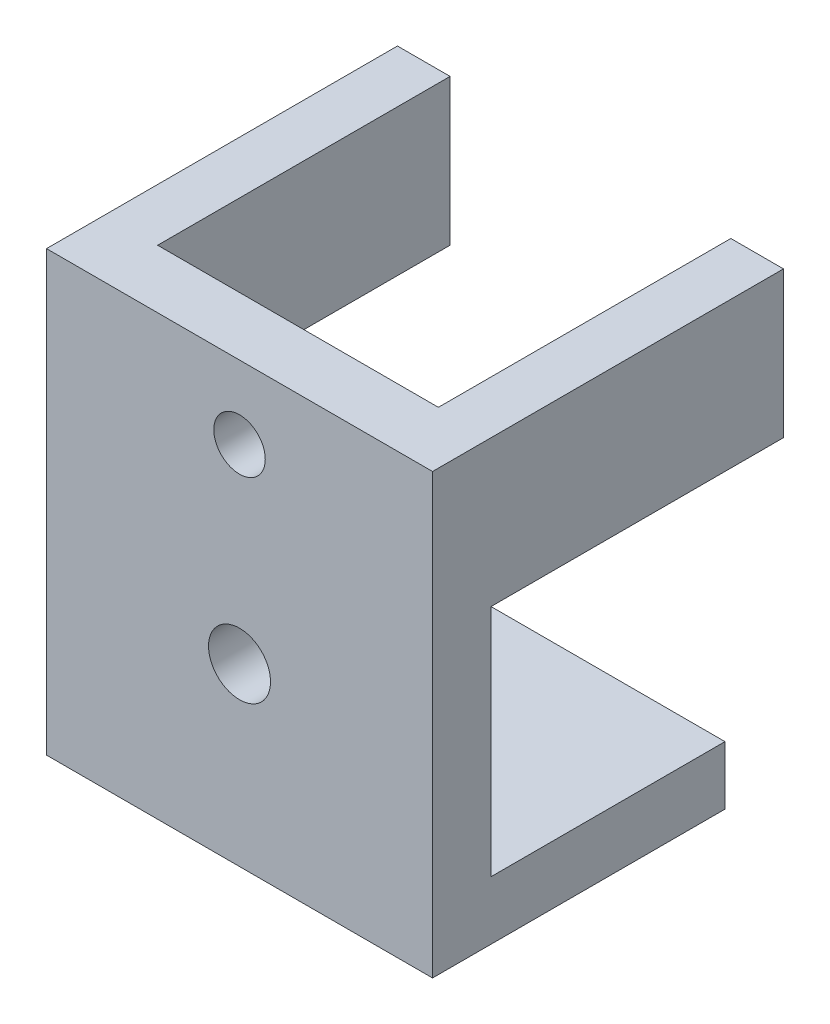
ISO-10303-21;
HEADER;
FILE_DESCRIPTION(('STEP AP214'),'2;1');
FILE_NAME('part.step','',(''),(''),'','','');
FILE_SCHEMA(('AUTOMOTIVE_DESIGN { 1 0 10303 214 1 1 1 1 }'));
ENDSEC;
DATA;
#1=APPLICATION_CONTEXT('core data for automotive mechanical design processes');
#2=APPLICATION_PROTOCOL_DEFINITION('international standard','automotive_design',2000,#1);
#3=PRODUCT_CONTEXT('',#1,'mechanical');
#4=PRODUCT('Part','Part','',(#3));
#5=PRODUCT_RELATED_PRODUCT_CATEGORY('part','',(#4));
#6=PRODUCT_DEFINITION_FORMATION('','',#4);
#7=PRODUCT_DEFINITION_CONTEXT('part definition',#1,'design');
#8=PRODUCT_DEFINITION('design','',#6,#7);
#9=PRODUCT_DEFINITION_SHAPE('','',#8);
#10=(LENGTH_UNIT() NAMED_UNIT(*) SI_UNIT(.MILLI.,.METRE.));
#11=(NAMED_UNIT(*) PLANE_ANGLE_UNIT() SI_UNIT($,.RADIAN.));
#12=(NAMED_UNIT(*) SI_UNIT($,.STERADIAN.) SOLID_ANGLE_UNIT());
#13=UNCERTAINTY_MEASURE_WITH_UNIT(LENGTH_MEASURE(1.E-05),#10,'distance_accuracy_value','');
#14=(GEOMETRIC_REPRESENTATION_CONTEXT(3) GLOBAL_UNCERTAINTY_ASSIGNED_CONTEXT((#13)) GLOBAL_UNIT_ASSIGNED_CONTEXT((#10,
#11,#12)) REPRESENTATION_CONTEXT('',''));
#15=CARTESIAN_POINT('',(0.,0.,0.));
#16=DIRECTION('',(0.,0.,1.));
#17=DIRECTION('',(1.,0.,0.));
#18=AXIS2_PLACEMENT_3D('',#15,#16,#17);
#19=CARTESIAN_POINT('',(0.,0.,0.));
#20=DIRECTION('',(0.,0.,-1.));
#21=DIRECTION('',(-1.,0.,0.));
#22=AXIS2_PLACEMENT_3D('',#19,#20,#21);
#23=PLANE('',#22);
#24=CARTESIAN_POINT('',(16.5,31.25,0.));
#25=DIRECTION('',(0.,0.,-1.));
#26=DIRECTION('',(-1.,0.,0.));
#27=AXIS2_PLACEMENT_3D('',#24,#25,#26);
#28=CIRCLE('',#27,2.2);
#29=CARTESIAN_POINT('',(14.3,31.25,0.));
#30=VERTEX_POINT('',#29);
#31=EDGE_CURVE('E158',#30,#30,#28,.T.);
#32=ORIENTED_EDGE('',*,*,#31,.F.);
#33=EDGE_LOOP('',(#32));
#34=FACE_BOUND('',#33,.T.);
#35=CARTESIAN_POINT('',(16.5,15.,0.));
#36=DIRECTION('',(0.,0.,-1.));
#37=DIRECTION('',(-1.,0.,0.));
#38=AXIS2_PLACEMENT_3D('',#35,#36,#37);
#39=CIRCLE('',#38,2.65);
#40=CARTESIAN_POINT('',(13.85,15.,0.));
#41=VERTEX_POINT('',#40);
#42=EDGE_CURVE('E190',#41,#41,#39,.T.);
#43=ORIENTED_EDGE('',*,*,#42,.F.);
#44=EDGE_LOOP('',(#43));
#45=FACE_BOUND('',#44,.T.);
#46=DIRECTION('',(-1.,0.,0.));
#47=VECTOR('',#46,1.);
#48=CARTESIAN_POINT('',(0.,25.,0.));
#49=LINE('',#48,#47);
#50=CARTESIAN_POINT('',(4.49999999999999,25.,0.));
#51=VERTEX_POINT('',#50);
#52=CARTESIAN_POINT('',(0.,25.,0.));
#53=VERTEX_POINT('',#52);
#54=EDGE_CURVE('E153',#51,#53,#49,.T.);
#55=ORIENTED_EDGE('',*,*,#54,.F.);
#56=DIRECTION('',(0.,-1.,0.));
#57=VECTOR('',#56,1.);
#58=CARTESIAN_POINT('',(4.49999999999999,37.5,0.));
#59=LINE('',#58,#57);
#60=CARTESIAN_POINT('',(4.49999999999999,37.5,0.));
#61=VERTEX_POINT('',#60);
#62=EDGE_CURVE('E155',#61,#51,#59,.T.);
#63=ORIENTED_EDGE('',*,*,#62,.F.);
#64=DIRECTION('',(-1.,0.,0.));
#65=VECTOR('',#64,1.);
#66=CARTESIAN_POINT('',(0.,37.5,0.));
#67=LINE('',#66,#65);
#68=CARTESIAN_POINT('',(28.5,37.5,0.));
#69=VERTEX_POINT('',#68);
#70=EDGE_CURVE('E218',#69,#61,#67,.T.);
#71=ORIENTED_EDGE('',*,*,#70,.F.);
#72=DIRECTION('',(0.,1.,0.));
#73=VECTOR('',#72,1.);
#74=CARTESIAN_POINT('',(28.5,37.5,0.));
#75=LINE('',#74,#73);
#76=CARTESIAN_POINT('',(28.5,25.,0.));
#77=VERTEX_POINT('',#76);
#78=EDGE_CURVE('E175',#77,#69,#75,.T.);
#79=ORIENTED_EDGE('',*,*,#78,.F.);
#80=DIRECTION('',(-1.,0.,0.));
#81=VECTOR('',#80,1.);
#82=CARTESIAN_POINT('',(33.,25.,0.));
#83=LINE('',#82,#81);
#84=CARTESIAN_POINT('',(33.,25.,0.));
#85=VERTEX_POINT('',#84);
#86=EDGE_CURVE('E170',#85,#77,#83,.T.);
#87=ORIENTED_EDGE('',*,*,#86,.F.);
#88=DIRECTION('',(0.,1.,0.));
#89=VECTOR('',#88,1.);
#90=CARTESIAN_POINT('',(33.,0.,0.));
#91=LINE('',#90,#89);
#92=CARTESIAN_POINT('',(33.,5.,0.));
#93=VERTEX_POINT('',#92);
#94=EDGE_CURVE('E224',#93,#85,#91,.T.);
#95=ORIENTED_EDGE('',*,*,#94,.F.);
#96=DIRECTION('',(-1.,0.,0.));
#97=VECTOR('',#96,1.);
#98=CARTESIAN_POINT('',(0.,5.,0.));
#99=LINE('',#98,#97);
#100=CARTESIAN_POINT('',(0.,5.,0.));
#101=VERTEX_POINT('',#100);
#102=EDGE_CURVE('E201',#93,#101,#99,.T.);
#103=ORIENTED_EDGE('',*,*,#102,.T.);
#104=DIRECTION('',(0.,-1.,0.));
#105=VECTOR('',#104,1.);
#106=CARTESIAN_POINT('',(0.,0.,0.));
#107=LINE('',#106,#105);
#108=EDGE_CURVE('E62',#53,#101,#107,.T.);
#109=ORIENTED_EDGE('',*,*,#108,.F.);
#110=EDGE_LOOP('',(#55,#63,#71,#79,#87,#95,#103,#109));
#111=FACE_BOUND('',#110,.T.);
#112=ADVANCED_FACE('F37',(#34,#45,#111),#23,.T.);
#113=CARTESIAN_POINT('',(0.,0.,5.));
#114=DIRECTION('',(1.,0.,0.));
#115=DIRECTION('',(0.,1.,0.));
#116=AXIS2_PLACEMENT_3D('',#113,#114,#115);
#117=PLANE('',#116);
#118=DIRECTION('',(0.,0.,-1.));
#119=VECTOR('',#118,1.);
#120=CARTESIAN_POINT('',(0.,37.5,5.));
#121=LINE('',#120,#119);
#122=CARTESIAN_POINT('',(0.,37.5,5.));
#123=VERTEX_POINT('',#122);
#124=CARTESIAN_POINT('',(0.,37.5,-25.));
#125=VERTEX_POINT('',#124);
#126=EDGE_CURVE('E130',#123,#125,#121,.T.);
#127=ORIENTED_EDGE('',*,*,#126,.T.);
#128=DIRECTION('',(0.,1.,0.));
#129=VECTOR('',#128,1.);
#130=CARTESIAN_POINT('',(0.,37.5,-25.));
#131=LINE('',#130,#129);
#132=CARTESIAN_POINT('',(0.,25.,-25.));
#133=VERTEX_POINT('',#132);
#134=EDGE_CURVE('E133',#133,#125,#131,.T.);
#135=ORIENTED_EDGE('',*,*,#134,.F.);
#136=DIRECTION('',(0.,0.,1.));
#137=VECTOR('',#136,1.);
#138=CARTESIAN_POINT('',(0.,25.,-25.));
#139=LINE('',#138,#137);
#140=EDGE_CURVE('E163',#133,#53,#139,.T.);
#141=ORIENTED_EDGE('',*,*,#140,.T.);
#142=ORIENTED_EDGE('',*,*,#108,.T.);
#143=DIRECTION('',(0.,0.,1.));
#144=VECTOR('',#143,1.);
#145=CARTESIAN_POINT('',(0.,5.,-20.));
#146=LINE('',#145,#144);
#147=CARTESIAN_POINT('',(0.,5.,-20.));
#148=VERTEX_POINT('',#147);
#149=EDGE_CURVE('E213',#148,#101,#146,.T.);
#150=ORIENTED_EDGE('',*,*,#149,.F.);
#151=DIRECTION('',(0.,-1.,0.));
#152=VECTOR('',#151,1.);
#153=CARTESIAN_POINT('',(0.,0.,-20.));
#154=LINE('',#153,#152);
#155=CARTESIAN_POINT('',(0.,0.,-20.));
#156=VERTEX_POINT('',#155);
#157=EDGE_CURVE('E197',#148,#156,#154,.T.);
#158=ORIENTED_EDGE('',*,*,#157,.T.);
#159=DIRECTION('',(0.,0.,-1.));
#160=VECTOR('',#159,1.);
#161=CARTESIAN_POINT('',(0.,0.,5.));
#162=LINE('',#161,#160);
#163=CARTESIAN_POINT('',(0.,0.,5.));
#164=VERTEX_POINT('',#163);
#165=EDGE_CURVE('E12',#164,#156,#162,.T.);
#166=ORIENTED_EDGE('',*,*,#165,.F.);
#167=DIRECTION('',(0.,-1.,0.));
#168=VECTOR('',#167,1.);
#169=CARTESIAN_POINT('',(0.,0.,5.));
#170=LINE('',#169,#168);
#171=EDGE_CURVE('E136',#123,#164,#170,.T.);
#172=ORIENTED_EDGE('',*,*,#171,.F.);
#173=EDGE_LOOP('',(#127,#135,#141,#142,#150,#158,#166,#172));
#174=FACE_BOUND('',#173,.T.);
#175=ADVANCED_FACE('F39',(#174),#117,.F.);
#176=CARTESIAN_POINT('',(0.,0.,5.));
#177=DIRECTION('',(0.,1.,0.));
#178=DIRECTION('',(0.,0.,1.));
#179=AXIS2_PLACEMENT_3D('',#176,#177,#178);
#180=PLANE('',#179);
#181=CARTESIAN_POINT('',(16.5,0.,-10.));
#182=DIRECTION('',(0.,-1.,0.));
#183=DIRECTION('',(0.,0.,-1.));
#184=AXIS2_PLACEMENT_3D('',#181,#182,#183);
#185=CIRCLE('',#184,2.65);
#186=CARTESIAN_POINT('',(16.5,0.,-12.65));
#187=VERTEX_POINT('',#186);
#188=EDGE_CURVE('E193',#187,#187,#185,.T.);
#189=ORIENTED_EDGE('',*,*,#188,.F.);
#190=EDGE_LOOP('',(#189));
#191=FACE_BOUND('',#190,.T.);
#192=ORIENTED_EDGE('',*,*,#165,.T.);
#193=DIRECTION('',(1.,0.,0.));
#194=VECTOR('',#193,1.);
#195=CARTESIAN_POINT('',(0.,0.,-20.));
#196=LINE('',#195,#194);
#197=CARTESIAN_POINT('',(33.,0.,-20.));
#198=VERTEX_POINT('',#197);
#199=EDGE_CURVE('E200',#156,#198,#196,.T.);
#200=ORIENTED_EDGE('',*,*,#199,.T.);
#201=DIRECTION('',(0.,0.,-1.));
#202=VECTOR('',#201,1.);
#203=CARTESIAN_POINT('',(33.,0.,5.));
#204=LINE('',#203,#202);
#205=CARTESIAN_POINT('',(33.,0.,5.));
#206=VERTEX_POINT('',#205);
#207=EDGE_CURVE('E46',#206,#198,#204,.T.);
#208=ORIENTED_EDGE('',*,*,#207,.F.);
#209=DIRECTION('',(1.,0.,0.));
#210=VECTOR('',#209,1.);
#211=CARTESIAN_POINT('',(0.,0.,5.));
#212=LINE('',#211,#210);
#213=EDGE_CURVE('E217',#164,#206,#212,.T.);
#214=ORIENTED_EDGE('',*,*,#213,.F.);
#215=EDGE_LOOP('',(#192,#200,#208,#214));
#216=FACE_BOUND('',#215,.T.);
#217=ADVANCED_FACE('F259',(#191,#216),#180,.F.);
#218=CARTESIAN_POINT('',(33.,0.,5.));
#219=DIRECTION('',(-1.,0.,0.));
#220=DIRECTION('',(0.,-1.,0.));
#221=AXIS2_PLACEMENT_3D('',#218,#219,#220);
#222=PLANE('',#221);
#223=ORIENTED_EDGE('',*,*,#207,.T.);
#224=DIRECTION('',(0.,1.,0.));
#225=VECTOR('',#224,1.);
#226=CARTESIAN_POINT('',(33.,0.,-20.));
#227=LINE('',#226,#225);
#228=CARTESIAN_POINT('',(33.,5.,-20.));
#229=VERTEX_POINT('',#228);
#230=EDGE_CURVE('E204',#198,#229,#227,.T.);
#231=ORIENTED_EDGE('',*,*,#230,.T.);
#232=DIRECTION('',(0.,0.,1.));
#233=VECTOR('',#232,1.);
#234=CARTESIAN_POINT('',(33.,5.,-20.));
#235=LINE('',#234,#233);
#236=EDGE_CURVE('E210',#229,#93,#235,.T.);
#237=ORIENTED_EDGE('',*,*,#236,.T.);
#238=ORIENTED_EDGE('',*,*,#94,.T.);
#239=DIRECTION('',(0.,0.,1.));
#240=VECTOR('',#239,1.);
#241=CARTESIAN_POINT('',(33.,25.,-25.));
#242=LINE('',#241,#240);
#243=CARTESIAN_POINT('',(33.,25.,-25.));
#244=VERTEX_POINT('',#243);
#245=EDGE_CURVE('E188',#244,#85,#242,.T.);
#246=ORIENTED_EDGE('',*,*,#245,.F.);
#247=DIRECTION('',(0.,-1.,0.));
#248=VECTOR('',#247,1.);
#249=CARTESIAN_POINT('',(33.,37.5,-25.));
#250=LINE('',#249,#248);
#251=CARTESIAN_POINT('',(33.,37.5,-25.));
#252=VERTEX_POINT('',#251);
#253=EDGE_CURVE('E171',#252,#244,#250,.T.);
#254=ORIENTED_EDGE('',*,*,#253,.F.);
#255=DIRECTION('',(0.,0.,-1.));
#256=VECTOR('',#255,1.);
#257=CARTESIAN_POINT('',(33.,37.5,5.));
#258=LINE('',#257,#256);
#259=CARTESIAN_POINT('',(33.,37.5,5.));
#260=VERTEX_POINT('',#259);
#261=EDGE_CURVE('E138',#260,#252,#258,.T.);
#262=ORIENTED_EDGE('',*,*,#261,.F.);
#263=DIRECTION('',(0.,1.,0.));
#264=VECTOR('',#263,1.);
#265=CARTESIAN_POINT('',(33.,0.,5.));
#266=LINE('',#265,#264);
#267=EDGE_CURVE('E220',#206,#260,#266,.T.);
#268=ORIENTED_EDGE('',*,*,#267,.F.);
#269=EDGE_LOOP('',(#223,#231,#237,#238,#246,#254,#262,#268));
#270=FACE_BOUND('',#269,.T.);
#271=ADVANCED_FACE('F249',(#270),#222,.F.);
#272=CARTESIAN_POINT('',(0.,37.5,5.));
#273=DIRECTION('',(0.,-1.,0.));
#274=DIRECTION('',(0.,0.,-1.));
#275=AXIS2_PLACEMENT_3D('',#272,#273,#274);
#276=PLANE('',#275);
#277=ORIENTED_EDGE('',*,*,#261,.T.);
#278=DIRECTION('',(1.,0.,0.));
#279=VECTOR('',#278,1.);
#280=CARTESIAN_POINT('',(33.,37.5,-25.));
#281=LINE('',#280,#279);
#282=CARTESIAN_POINT('',(28.5,37.5,-25.));
#283=VERTEX_POINT('',#282);
#284=EDGE_CURVE('E179',#283,#252,#281,.T.);
#285=ORIENTED_EDGE('',*,*,#284,.F.);
#286=DIRECTION('',(0.,0.,1.));
#287=VECTOR('',#286,1.);
#288=CARTESIAN_POINT('',(28.5,37.5,-25.));
#289=LINE('',#288,#287);
#290=EDGE_CURVE('E54',#283,#69,#289,.T.);
#291=ORIENTED_EDGE('',*,*,#290,.T.);
#292=ORIENTED_EDGE('',*,*,#70,.T.);
#293=DIRECTION('',(0.,0.,1.));
#294=VECTOR('',#293,1.);
#295=CARTESIAN_POINT('',(4.49999999999999,37.5,-25.));
#296=LINE('',#295,#294);
#297=CARTESIAN_POINT('',(4.49999999999999,37.5,-25.));
#298=VERTEX_POINT('',#297);
#299=EDGE_CURVE('E144',#298,#61,#296,.T.);
#300=ORIENTED_EDGE('',*,*,#299,.F.);
#301=DIRECTION('',(1.,0.,0.));
#302=VECTOR('',#301,1.);
#303=CARTESIAN_POINT('',(0.,37.5,-25.));
#304=LINE('',#303,#302);
#305=EDGE_CURVE('E142',#125,#298,#304,.T.);
#306=ORIENTED_EDGE('',*,*,#305,.F.);
#307=ORIENTED_EDGE('',*,*,#126,.F.);
#308=DIRECTION('',(-1.,0.,0.));
#309=VECTOR('',#308,1.);
#310=CARTESIAN_POINT('',(0.,37.5,5.));
#311=LINE('',#310,#309);
#312=EDGE_CURVE('E139',#260,#123,#311,.T.);
#313=ORIENTED_EDGE('',*,*,#312,.F.);
#314=EDGE_LOOP('',(#277,#285,#291,#292,#300,#306,#307,#313));
#315=FACE_BOUND('',#314,.T.);
#316=ADVANCED_FACE('F143',(#315),#276,.F.);
#317=CARTESIAN_POINT('',(0.,0.,5.));
#318=DIRECTION('',(0.,0.,-1.));
#319=DIRECTION('',(-1.,0.,0.));
#320=AXIS2_PLACEMENT_3D('',#317,#318,#319);
#321=PLANE('',#320);
#322=CARTESIAN_POINT('',(16.5,31.25,5.));
#323=DIRECTION('',(0.,0.,1.));
#324=DIRECTION('',(1.,0.,0.));
#325=AXIS2_PLACEMENT_3D('',#322,#323,#324);
#326=CIRCLE('',#325,2.2);
#327=CARTESIAN_POINT('',(18.7,31.25,5.));
#328=VERTEX_POINT('',#327);
#329=EDGE_CURVE('E371',#328,#328,#326,.T.);
#330=ORIENTED_EDGE('',*,*,#329,.F.);
#331=EDGE_LOOP('',(#330));
#332=FACE_BOUND('',#331,.T.);
#333=CARTESIAN_POINT('',(16.5,15.,5.));
#334=DIRECTION('',(0.,0.,-1.));
#335=DIRECTION('',(-1.,0.,0.));
#336=AXIS2_PLACEMENT_3D('',#333,#334,#335);
#337=CIRCLE('',#336,2.65);
#338=CARTESIAN_POINT('',(13.85,15.,5.));
#339=VERTEX_POINT('',#338);
#340=EDGE_CURVE('E41',#339,#339,#337,.T.);
#341=ORIENTED_EDGE('',*,*,#340,.T.);
#342=EDGE_LOOP('',(#341));
#343=FACE_BOUND('',#342,.T.);
#344=ORIENTED_EDGE('',*,*,#171,.T.);
#345=ORIENTED_EDGE('',*,*,#213,.T.);
#346=ORIENTED_EDGE('',*,*,#267,.T.);
#347=ORIENTED_EDGE('',*,*,#312,.T.);
#348=EDGE_LOOP('',(#344,#345,#346,#347));
#349=FACE_BOUND('',#348,.T.);
#350=ADVANCED_FACE('F239',(#332,#343,#349),#321,.F.);
#351=CARTESIAN_POINT('',(0.,5.,-20.));
#352=DIRECTION('',(0.,1.,0.));
#353=DIRECTION('',(0.,0.,1.));
#354=AXIS2_PLACEMENT_3D('',#351,#352,#353);
#355=PLANE('',#354);
#356=CARTESIAN_POINT('',(16.5,5.,-10.));
#357=DIRECTION('',(0.,1.,0.));
#358=DIRECTION('',(0.,0.,1.));
#359=AXIS2_PLACEMENT_3D('',#356,#357,#358);
#360=CIRCLE('',#359,2.65);
#361=CARTESIAN_POINT('',(16.5,5.,-7.34999999999999));
#362=VERTEX_POINT('',#361);
#363=EDGE_CURVE('E196',#362,#362,#360,.T.);
#364=ORIENTED_EDGE('',*,*,#363,.F.);
#365=EDGE_LOOP('',(#364));
#366=FACE_BOUND('',#365,.T.);
#367=ORIENTED_EDGE('',*,*,#102,.F.);
#368=ORIENTED_EDGE('',*,*,#236,.F.);
#369=DIRECTION('',(-1.,0.,0.));
#370=VECTOR('',#369,1.);
#371=CARTESIAN_POINT('',(0.,5.,-20.));
#372=LINE('',#371,#370);
#373=EDGE_CURVE('E207',#229,#148,#372,.T.);
#374=ORIENTED_EDGE('',*,*,#373,.T.);
#375=ORIENTED_EDGE('',*,*,#149,.T.);
#376=EDGE_LOOP('',(#367,#368,#374,#375));
#377=FACE_BOUND('',#376,.T.);
#378=ADVANCED_FACE('F235',(#366,#377),#355,.T.);
#379=CARTESIAN_POINT('',(0.,0.,-20.));
#380=DIRECTION('',(0.,0.,-1.));
#381=DIRECTION('',(-1.,0.,0.));
#382=AXIS2_PLACEMENT_3D('',#379,#380,#381);
#383=PLANE('',#382);
#384=ORIENTED_EDGE('',*,*,#157,.F.);
#385=ORIENTED_EDGE('',*,*,#373,.F.);
#386=ORIENTED_EDGE('',*,*,#230,.F.);
#387=ORIENTED_EDGE('',*,*,#199,.F.);
#388=EDGE_LOOP('',(#384,#385,#386,#387));
#389=FACE_BOUND('',#388,.T.);
#390=ADVANCED_FACE('F238',(#389),#383,.T.);
#391=CARTESIAN_POINT('',(16.5,10.,-10.));
#392=DIRECTION('',(0.,-1.,0.));
#393=DIRECTION('',(0.,0.,-1.));
#394=AXIS2_PLACEMENT_3D('',#391,#392,#393);
#395=CYLINDRICAL_SURFACE('',#394,2.65);
#396=ORIENTED_EDGE('',*,*,#363,.T.);
#397=EDGE_LOOP('',(#396));
#398=FACE_BOUND('',#397,.T.);
#399=ORIENTED_EDGE('',*,*,#188,.T.);
#400=EDGE_LOOP('',(#399));
#401=FACE_BOUND('',#400,.T.);
#402=ADVANCED_FACE('F232',(#398,#401),#395,.F.);
#403=CARTESIAN_POINT('',(16.5,15.,10.));
#404=DIRECTION('',(0.,0.,-1.));
#405=DIRECTION('',(-1.,0.,0.));
#406=AXIS2_PLACEMENT_3D('',#403,#404,#405);
#407=CYLINDRICAL_SURFACE('',#406,2.65);
#408=ORIENTED_EDGE('',*,*,#42,.T.);
#409=EDGE_LOOP('',(#408));
#410=FACE_BOUND('',#409,.T.);
#411=ORIENTED_EDGE('',*,*,#340,.F.);
#412=EDGE_LOOP('',(#411));
#413=FACE_BOUND('',#412,.T.);
#414=ADVANCED_FACE('F303',(#410,#413),#407,.F.);
#415=CARTESIAN_POINT('',(33.,25.,-25.));
#416=DIRECTION('',(0.,1.,0.));
#417=DIRECTION('',(0.,0.,1.));
#418=AXIS2_PLACEMENT_3D('',#415,#416,#417);
#419=PLANE('',#418);
#420=ORIENTED_EDGE('',*,*,#86,.T.);
#421=DIRECTION('',(0.,0.,1.));
#422=VECTOR('',#421,1.);
#423=CARTESIAN_POINT('',(28.5,25.,-25.));
#424=LINE('',#423,#422);
#425=CARTESIAN_POINT('',(28.5,25.,-25.));
#426=VERTEX_POINT('',#425);
#427=EDGE_CURVE('E185',#426,#77,#424,.T.);
#428=ORIENTED_EDGE('',*,*,#427,.F.);
#429=DIRECTION('',(-1.,0.,0.));
#430=VECTOR('',#429,1.);
#431=CARTESIAN_POINT('',(33.,25.,-25.));
#432=LINE('',#431,#430);
#433=EDGE_CURVE('E174',#244,#426,#432,.T.);
#434=ORIENTED_EDGE('',*,*,#433,.F.);
#435=ORIENTED_EDGE('',*,*,#245,.T.);
#436=EDGE_LOOP('',(#420,#428,#434,#435));
#437=FACE_BOUND('',#436,.T.);
#438=ADVANCED_FACE('F309',(#437),#419,.F.);
#439=CARTESIAN_POINT('',(28.5,37.5,-25.));
#440=DIRECTION('',(1.,0.,0.));
#441=DIRECTION('',(0.,0.,-1.));
#442=AXIS2_PLACEMENT_3D('',#439,#440,#441);
#443=PLANE('',#442);
#444=ORIENTED_EDGE('',*,*,#78,.T.);
#445=ORIENTED_EDGE('',*,*,#290,.F.);
#446=DIRECTION('',(0.,1.,0.));
#447=VECTOR('',#446,1.);
#448=CARTESIAN_POINT('',(28.5,37.5,-25.));
#449=LINE('',#448,#447);
#450=EDGE_CURVE('E177',#426,#283,#449,.T.);
#451=ORIENTED_EDGE('',*,*,#450,.F.);
#452=ORIENTED_EDGE('',*,*,#427,.T.);
#453=EDGE_LOOP('',(#444,#445,#451,#452));
#454=FACE_BOUND('',#453,.T.);
#455=ADVANCED_FACE('F267',(#454),#443,.F.);
#456=CARTESIAN_POINT('',(0.,0.,-25.));
#457=DIRECTION('',(0.,0.,-1.));
#458=DIRECTION('',(-1.,0.,0.));
#459=AXIS2_PLACEMENT_3D('',#456,#457,#458);
#460=PLANE('',#459);
#461=ORIENTED_EDGE('',*,*,#253,.T.);
#462=ORIENTED_EDGE('',*,*,#433,.T.);
#463=ORIENTED_EDGE('',*,*,#450,.T.);
#464=ORIENTED_EDGE('',*,*,#284,.T.);
#465=EDGE_LOOP('',(#461,#462,#463,#464));
#466=FACE_BOUND('',#465,.T.);
#467=ADVANCED_FACE('F263',(#466),#460,.T.);
#468=CARTESIAN_POINT('',(4.49999999999999,37.5,-25.));
#469=DIRECTION('',(-1.,0.,0.));
#470=DIRECTION('',(0.,-1.,0.));
#471=AXIS2_PLACEMENT_3D('',#468,#469,#470);
#472=PLANE('',#471);
#473=ORIENTED_EDGE('',*,*,#62,.T.);
#474=DIRECTION('',(0.,0.,1.));
#475=VECTOR('',#474,1.);
#476=CARTESIAN_POINT('',(4.49999999999999,25.,-25.));
#477=LINE('',#476,#475);
#478=CARTESIAN_POINT('',(4.49999999999999,25.,-25.));
#479=VERTEX_POINT('',#478);
#480=EDGE_CURVE('E166',#479,#51,#477,.T.);
#481=ORIENTED_EDGE('',*,*,#480,.F.);
#482=DIRECTION('',(0.,-1.,0.));
#483=VECTOR('',#482,1.);
#484=CARTESIAN_POINT('',(4.49999999999999,37.5,-25.));
#485=LINE('',#484,#483);
#486=EDGE_CURVE('E147',#298,#479,#485,.T.);
#487=ORIENTED_EDGE('',*,*,#486,.F.);
#488=ORIENTED_EDGE('',*,*,#299,.T.);
#489=EDGE_LOOP('',(#473,#481,#487,#488));
#490=FACE_BOUND('',#489,.T.);
#491=ADVANCED_FACE('F272',(#490),#472,.F.);
#492=CARTESIAN_POINT('',(0.,25.,-25.));
#493=DIRECTION('',(0.,1.,0.));
#494=DIRECTION('',(0.,0.,1.));
#495=AXIS2_PLACEMENT_3D('',#492,#493,#494);
#496=PLANE('',#495);
#497=ORIENTED_EDGE('',*,*,#54,.T.);
#498=ORIENTED_EDGE('',*,*,#140,.F.);
#499=DIRECTION('',(-1.,0.,0.));
#500=VECTOR('',#499,1.);
#501=CARTESIAN_POINT('',(0.,25.,-25.));
#502=LINE('',#501,#500);
#503=EDGE_CURVE('E151',#479,#133,#502,.T.);
#504=ORIENTED_EDGE('',*,*,#503,.F.);
#505=ORIENTED_EDGE('',*,*,#480,.T.);
#506=EDGE_LOOP('',(#497,#498,#504,#505));
#507=FACE_BOUND('',#506,.T.);
#508=ADVANCED_FACE('F274',(#507),#496,.F.);
#509=CARTESIAN_POINT('',(0.,0.,-25.));
#510=DIRECTION('',(0.,0.,1.));
#511=DIRECTION('',(1.,0.,0.));
#512=AXIS2_PLACEMENT_3D('',#509,#510,#511);
#513=PLANE('',#512);
#514=ORIENTED_EDGE('',*,*,#134,.T.);
#515=ORIENTED_EDGE('',*,*,#305,.T.);
#516=ORIENTED_EDGE('',*,*,#486,.T.);
#517=ORIENTED_EDGE('',*,*,#503,.T.);
#518=EDGE_LOOP('',(#514,#515,#516,#517));
#519=FACE_BOUND('',#518,.T.);
#520=ADVANCED_FACE('F149',(#519),#513,.F.);
#521=CARTESIAN_POINT('',(16.5,31.25,-5.));
#522=DIRECTION('',(0.,0.,1.));
#523=DIRECTION('',(1.,0.,0.));
#524=AXIS2_PLACEMENT_3D('',#521,#522,#523);
#525=CYLINDRICAL_SURFACE('',#524,2.2);
#526=ORIENTED_EDGE('',*,*,#31,.T.);
#527=EDGE_LOOP('',(#526));
#528=FACE_BOUND('',#527,.T.);
#529=ORIENTED_EDGE('',*,*,#329,.T.);
#530=EDGE_LOOP('',(#529));
#531=FACE_BOUND('',#530,.T.);
#532=ADVANCED_FACE('F281',(#528,#531),#525,.F.);
#533=CLOSED_SHELL('',(#112,#175,#217,#271,#316,#350,#378,#390,#402,#414,#438,#455,#467,#491,
#508,#520,#532));
#534=MANIFOLD_SOLID_BREP('B2',#533);
#535=ADVANCED_BREP_SHAPE_REPRESENTATION('',(#18,#534),#14);
#536=SHAPE_DEFINITION_REPRESENTATION(#9,#535);
ENDSEC;
END-ISO-10303-21;
